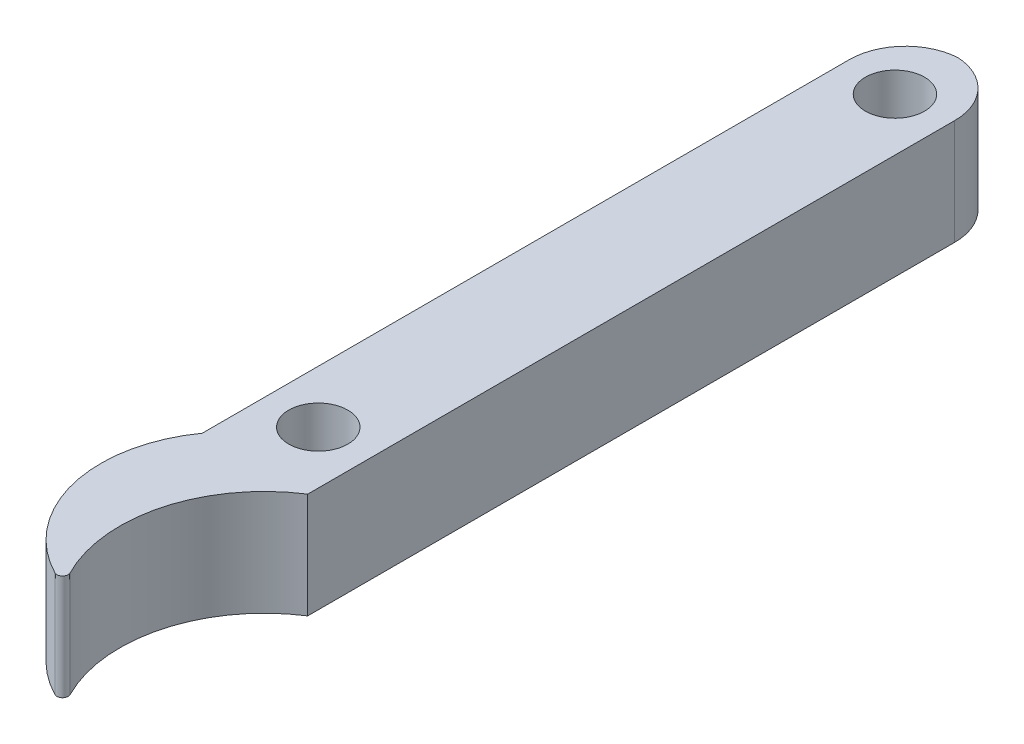
ISO-10303-21;
HEADER;
FILE_DESCRIPTION(('STEP AP214'),'2;1');
FILE_NAME('part.step','',(''),(''),'','','');
FILE_SCHEMA(('AUTOMOTIVE_DESIGN { 1 0 10303 214 1 1 1 1 }'));
ENDSEC;
DATA;
#1=APPLICATION_CONTEXT('core data for automotive mechanical design processes');
#2=APPLICATION_PROTOCOL_DEFINITION('international standard','automotive_design',2000,#1);
#3=PRODUCT_CONTEXT('',#1,'mechanical');
#4=PRODUCT('Part','Part','',(#3));
#5=PRODUCT_RELATED_PRODUCT_CATEGORY('part','',(#4));
#6=PRODUCT_DEFINITION_FORMATION('','',#4);
#7=PRODUCT_DEFINITION_CONTEXT('part definition',#1,'design');
#8=PRODUCT_DEFINITION('design','',#6,#7);
#9=PRODUCT_DEFINITION_SHAPE('','',#8);
#10=(LENGTH_UNIT() NAMED_UNIT(*) SI_UNIT(.MILLI.,.METRE.));
#11=(NAMED_UNIT(*) PLANE_ANGLE_UNIT() SI_UNIT($,.RADIAN.));
#12=(NAMED_UNIT(*) SI_UNIT($,.STERADIAN.) SOLID_ANGLE_UNIT());
#13=UNCERTAINTY_MEASURE_WITH_UNIT(LENGTH_MEASURE(1.E-05),#10,'distance_accuracy_value','');
#14=(GEOMETRIC_REPRESENTATION_CONTEXT(3) GLOBAL_UNCERTAINTY_ASSIGNED_CONTEXT((#13)) GLOBAL_UNIT_ASSIGNED_CONTEXT((#10,
#11,#12)) REPRESENTATION_CONTEXT('',''));
#15=CARTESIAN_POINT('',(0.,0.,0.));
#16=DIRECTION('',(0.,0.,1.));
#17=DIRECTION('',(1.,0.,0.));
#18=AXIS2_PLACEMENT_3D('',#15,#16,#17);
#19=CARTESIAN_POINT('',(11.8186085481253,9.525,42.7233571040695));
#20=DIRECTION('',(0.,-1.,0.));
#21=DIRECTION('',(0.,0.,-1.));
#22=AXIS2_PLACEMENT_3D('',#19,#20,#21);
#23=PLANE('',#22);
#24=CARTESIAN_POINT('',(4.96913287929491,9.525,38.6874450668192));
#25=DIRECTION('',(0.,1.,0.));
#26=DIRECTION('',(0.,0.,1.));
#27=AXIS2_PLACEMENT_3D('',#24,#25,#26);
#28=CIRCLE('',#27,11.9512686587035);
#29=CARTESIAN_POINT('',(-4.7625,9.525,31.75));
#30=VERTEX_POINT('',#29);
#31=CARTESIAN_POINT('',(-0.497427924267538,9.525,49.3152169656446));
#32=VERTEX_POINT('',#31);
#33=EDGE_CURVE('E136',#30,#32,#28,.T.);
#34=ORIENTED_EDGE('',*,*,#33,.T.);
#35=CARTESIAN_POINT('',(-0.265066576906531,9.525,48.8634734496396));
#36=DIRECTION('',(0.,-1.,0.));
#37=DIRECTION('',(0.,0.,-1.));
#38=AXIS2_PLACEMENT_3D('',#35,#36,#37);
#39=CIRCLE('',#38,0.508);
#40=CARTESIAN_POINT('',(0.187819517976608,9.525,48.6333469951379));
#41=VERTEX_POINT('',#40);
#42=EDGE_CURVE('E11',#32,#41,#39,.F.);
#43=ORIENTED_EDGE('',*,*,#42,.T.);
#44=CARTESIAN_POINT('',(11.8186085481253,9.525,42.7233571040695));
#45=DIRECTION('',(0.,-1.,0.));
#46=DIRECTION('',(0.,0.,-1.));
#47=AXIS2_PLACEMENT_3D('',#44,#45,#46);
#48=CIRCLE('',#47,13.0461961496966);
#49=CARTESIAN_POINT('',(4.7625,9.525,31.75));
#50=VERTEX_POINT('',#49);
#51=EDGE_CURVE('E106',#41,#50,#48,.T.);
#52=ORIENTED_EDGE('',*,*,#51,.T.);
#53=DIRECTION('',(0.,0.,-1.));
#54=VECTOR('',#53,1.);
#55=CARTESIAN_POINT('',(4.7625,9.525,-31.75));
#56=LINE('',#55,#54);
#57=CARTESIAN_POINT('',(4.7625,9.525,-26.67));
#58=VERTEX_POINT('',#57);
#59=EDGE_CURVE('E109',#50,#58,#56,.T.);
#60=ORIENTED_EDGE('',*,*,#59,.T.);
#61=CARTESIAN_POINT('',(-0.317500000000002,9.525,-26.67));
#62=DIRECTION('',(0.,-1.,0.));
#63=DIRECTION('',(0.,0.,-1.));
#64=AXIS2_PLACEMENT_3D('',#61,#62,#63);
#65=CIRCLE('',#64,5.08);
#66=CARTESIAN_POINT('',(0.,9.525,-31.7400684166981));
#67=VERTEX_POINT('',#66);
#68=EDGE_CURVE('E144',#58,#67,#65,.F.);
#69=ORIENTED_EDGE('',*,*,#68,.T.);
#70=CARTESIAN_POINT('',(0.317499999999996,9.525,-26.67));
#71=DIRECTION('',(0.,-1.,0.));
#72=DIRECTION('',(0.,0.,-1.));
#73=AXIS2_PLACEMENT_3D('',#70,#71,#72);
#74=CIRCLE('',#73,5.08);
#75=CARTESIAN_POINT('',(-4.7625,9.525,-26.67));
#76=VERTEX_POINT('',#75);
#77=EDGE_CURVE('E142',#67,#76,#74,.F.);
#78=ORIENTED_EDGE('',*,*,#77,.T.);
#79=DIRECTION('',(0.,0.,1.));
#80=VECTOR('',#79,1.);
#81=CARTESIAN_POINT('',(-4.7625,9.525,-31.75));
#82=LINE('',#81,#80);
#83=EDGE_CURVE('E125',#76,#30,#82,.T.);
#84=ORIENTED_EDGE('',*,*,#83,.T.);
#85=EDGE_LOOP('',(#34,#43,#52,#60,#69,#78,#84));
#86=FACE_BOUND('',#85,.T.);
#87=CARTESIAN_POINT('',(0.,9.525,26.035));
#88=DIRECTION('',(0.,1.,0.));
#89=DIRECTION('',(0.,0.,1.));
#90=AXIS2_PLACEMENT_3D('',#87,#88,#89);
#91=CIRCLE('',#90,2.667);
#92=CARTESIAN_POINT('',(0.,9.525,23.368));
#93=VERTEX_POINT('',#92);
#94=EDGE_CURVE('E158',#93,#93,#91,.T.);
#95=ORIENTED_EDGE('',*,*,#94,.F.);
#96=EDGE_LOOP('',(#95));
#97=FACE_BOUND('',#96,.T.);
#98=CARTESIAN_POINT('',(0.,9.525,-26.035));
#99=DIRECTION('',(0.,1.,0.));
#100=DIRECTION('',(0.,0.,1.));
#101=AXIS2_PLACEMENT_3D('',#98,#99,#100);
#102=CIRCLE('',#101,2.667);
#103=CARTESIAN_POINT('',(0.,9.525,-28.702));
#104=VERTEX_POINT('',#103);
#105=EDGE_CURVE('E214',#104,#104,#102,.T.);
#106=ORIENTED_EDGE('',*,*,#105,.F.);
#107=EDGE_LOOP('',(#106));
#108=FACE_BOUND('',#107,.T.);
#109=ADVANCED_FACE('F47',(#86,#97,#108),#23,.F.);
#110=CARTESIAN_POINT('',(11.8186085481253,0.,42.7233571040695));
#111=DIRECTION('',(0.,-1.,0.));
#112=DIRECTION('',(0.,0.,-1.));
#113=AXIS2_PLACEMENT_3D('',#110,#111,#112);
#114=PLANE('',#113);
#115=CARTESIAN_POINT('',(0.,0.,26.035));
#116=DIRECTION('',(0.,1.,0.));
#117=DIRECTION('',(0.,0.,1.));
#118=AXIS2_PLACEMENT_3D('',#115,#116,#117);
#119=CIRCLE('',#118,2.667);
#120=CARTESIAN_POINT('',(0.,0.,23.368));
#121=VERTEX_POINT('',#120);
#122=EDGE_CURVE('E163',#121,#121,#119,.T.);
#123=ORIENTED_EDGE('',*,*,#122,.T.);
#124=EDGE_LOOP('',(#123));
#125=FACE_BOUND('',#124,.T.);
#126=CARTESIAN_POINT('',(11.8186085481253,0.,42.7233571040695));
#127=DIRECTION('',(0.,-1.,0.));
#128=DIRECTION('',(0.,0.,-1.));
#129=AXIS2_PLACEMENT_3D('',#126,#127,#128);
#130=CIRCLE('',#129,13.0461961496966);
#131=CARTESIAN_POINT('',(0.187819517976608,0.,48.6333469951379));
#132=VERTEX_POINT('',#131);
#133=CARTESIAN_POINT('',(4.7625,0.,31.75));
#134=VERTEX_POINT('',#133);
#135=EDGE_CURVE('E128',#132,#134,#130,.T.);
#136=ORIENTED_EDGE('',*,*,#135,.F.);
#137=CARTESIAN_POINT('',(-0.265066576906531,0.,48.8634734496396));
#138=DIRECTION('',(0.,-1.,0.));
#139=DIRECTION('',(0.,0.,-1.));
#140=AXIS2_PLACEMENT_3D('',#137,#138,#139);
#141=CIRCLE('',#140,0.508);
#142=CARTESIAN_POINT('',(-0.497427924267538,0.,49.3152169656446));
#143=VERTEX_POINT('',#142);
#144=EDGE_CURVE('E69',#132,#143,#141,.T.);
#145=ORIENTED_EDGE('',*,*,#144,.T.);
#146=CARTESIAN_POINT('',(4.96913287929491,0.,38.6874450668192));
#147=DIRECTION('',(0.,1.,0.));
#148=DIRECTION('',(0.,0.,1.));
#149=AXIS2_PLACEMENT_3D('',#146,#147,#148);
#150=CIRCLE('',#149,11.9512686587035);
#151=CARTESIAN_POINT('',(-4.7625,0.,31.75));
#152=VERTEX_POINT('',#151);
#153=EDGE_CURVE('E115',#152,#143,#150,.T.);
#154=ORIENTED_EDGE('',*,*,#153,.F.);
#155=DIRECTION('',(0.,0.,1.));
#156=VECTOR('',#155,1.);
#157=CARTESIAN_POINT('',(-4.7625,0.,-31.75));
#158=LINE('',#157,#156);
#159=CARTESIAN_POINT('',(-4.7625,0.,-26.67));
#160=VERTEX_POINT('',#159);
#161=EDGE_CURVE('E160',#160,#152,#158,.T.);
#162=ORIENTED_EDGE('',*,*,#161,.F.);
#163=CARTESIAN_POINT('',(0.317499999999996,0.,-26.67));
#164=DIRECTION('',(0.,-1.,0.));
#165=DIRECTION('',(0.,0.,-1.));
#166=AXIS2_PLACEMENT_3D('',#163,#164,#165);
#167=CIRCLE('',#166,5.08);
#168=CARTESIAN_POINT('',(0.,0.,-31.7400684166981));
#169=VERTEX_POINT('',#168);
#170=EDGE_CURVE('E130',#160,#169,#167,.T.);
#171=ORIENTED_EDGE('',*,*,#170,.T.);
#172=CARTESIAN_POINT('',(-0.317500000000002,0.,-26.67));
#173=DIRECTION('',(0.,-1.,0.));
#174=DIRECTION('',(0.,0.,-1.));
#175=AXIS2_PLACEMENT_3D('',#172,#173,#174);
#176=CIRCLE('',#175,5.08);
#177=CARTESIAN_POINT('',(4.7625,0.,-26.67));
#178=VERTEX_POINT('',#177);
#179=EDGE_CURVE('E133',#169,#178,#176,.T.);
#180=ORIENTED_EDGE('',*,*,#179,.T.);
#181=DIRECTION('',(0.,0.,-1.));
#182=VECTOR('',#181,1.);
#183=CARTESIAN_POINT('',(4.7625,0.,-31.75));
#184=LINE('',#183,#182);
#185=EDGE_CURVE('E157',#134,#178,#184,.T.);
#186=ORIENTED_EDGE('',*,*,#185,.F.);
#187=EDGE_LOOP('',(#136,#145,#154,#162,#171,#180,#186));
#188=FACE_BOUND('',#187,.T.);
#189=CARTESIAN_POINT('',(0.,0.,-26.035));
#190=DIRECTION('',(0.,1.,0.));
#191=DIRECTION('',(0.,0.,1.));
#192=AXIS2_PLACEMENT_3D('',#189,#190,#191);
#193=CIRCLE('',#192,2.667);
#194=CARTESIAN_POINT('',(0.,0.,-28.702));
#195=VERTEX_POINT('',#194);
#196=EDGE_CURVE('E152',#195,#195,#193,.T.);
#197=ORIENTED_EDGE('',*,*,#196,.T.);
#198=EDGE_LOOP('',(#197));
#199=FACE_BOUND('',#198,.T.);
#200=ADVANCED_FACE('F155',(#125,#188,#199),#114,.T.);
#201=CARTESIAN_POINT('',(11.8186085481253,9.525,42.7233571040695));
#202=DIRECTION('',(0.,-1.,0.));
#203=DIRECTION('',(0.,0.,-1.));
#204=AXIS2_PLACEMENT_3D('',#201,#202,#203);
#205=CYLINDRICAL_SURFACE('',#204,13.0461961496966);
#206=ORIENTED_EDGE('',*,*,#51,.F.);
#207=DIRECTION('',(0.,-1.,0.));
#208=VECTOR('',#207,1.);
#209=CARTESIAN_POINT('',(0.187819517976608,9.525,48.6333469951379));
#210=LINE('',#209,#208);
#211=EDGE_CURVE('E148',#41,#132,#210,.T.);
#212=ORIENTED_EDGE('',*,*,#211,.T.);
#213=ORIENTED_EDGE('',*,*,#135,.T.);
#214=DIRECTION('',(0.,-1.,0.));
#215=VECTOR('',#214,1.);
#216=CARTESIAN_POINT('',(4.7625,9.525,31.75));
#217=LINE('',#216,#215);
#218=EDGE_CURVE('E122',#50,#134,#217,.T.);
#219=ORIENTED_EDGE('',*,*,#218,.F.);
#220=EDGE_LOOP('',(#206,#212,#213,#219));
#221=FACE_BOUND('',#220,.T.);
#222=ADVANCED_FACE('F127',(#221),#205,.F.);
#223=CARTESIAN_POINT('',(4.7625,9.525,-31.75));
#224=DIRECTION('',(-1.,0.,0.));
#225=DIRECTION('',(0.,0.,1.));
#226=AXIS2_PLACEMENT_3D('',#223,#224,#225);
#227=PLANE('',#226);
#228=ORIENTED_EDGE('',*,*,#185,.T.);
#229=DIRECTION('',(0.,-1.,0.));
#230=VECTOR('',#229,1.);
#231=CARTESIAN_POINT('',(4.7625,9.525,-26.67));
#232=LINE('',#231,#230);
#233=EDGE_CURVE('E124',#178,#58,#232,.F.);
#234=ORIENTED_EDGE('',*,*,#233,.T.);
#235=ORIENTED_EDGE('',*,*,#59,.F.);
#236=ORIENTED_EDGE('',*,*,#218,.T.);
#237=EDGE_LOOP('',(#228,#234,#235,#236));
#238=FACE_BOUND('',#237,.T.);
#239=ADVANCED_FACE('F121',(#238),#227,.F.);
#240=CARTESIAN_POINT('',(-4.7625,9.525,-31.75));
#241=DIRECTION('',(1.,0.,0.));
#242=DIRECTION('',(0.,0.,-1.));
#243=AXIS2_PLACEMENT_3D('',#240,#241,#242);
#244=PLANE('',#243);
#245=ORIENTED_EDGE('',*,*,#83,.F.);
#246=DIRECTION('',(0.,-1.,0.));
#247=VECTOR('',#246,1.);
#248=CARTESIAN_POINT('',(-4.7625,9.525,-26.67));
#249=LINE('',#248,#247);
#250=EDGE_CURVE('E146',#76,#160,#249,.T.);
#251=ORIENTED_EDGE('',*,*,#250,.T.);
#252=ORIENTED_EDGE('',*,*,#161,.T.);
#253=DIRECTION('',(0.,-1.,0.));
#254=VECTOR('',#253,1.);
#255=CARTESIAN_POINT('',(-4.7625,9.525,31.75));
#256=LINE('',#255,#254);
#257=EDGE_CURVE('E131',#30,#152,#256,.T.);
#258=ORIENTED_EDGE('',*,*,#257,.F.);
#259=EDGE_LOOP('',(#245,#251,#252,#258));
#260=FACE_BOUND('',#259,.T.);
#261=ADVANCED_FACE('F192',(#260),#244,.F.);
#262=CARTESIAN_POINT('',(4.96913287929491,9.525,38.6874450668192));
#263=DIRECTION('',(0.,-1.,0.));
#264=DIRECTION('',(0.,0.,-1.));
#265=AXIS2_PLACEMENT_3D('',#262,#263,#264);
#266=CYLINDRICAL_SURFACE('',#265,11.9512686587035);
#267=ORIENTED_EDGE('',*,*,#153,.T.);
#268=DIRECTION('',(0.,-1.,0.));
#269=VECTOR('',#268,1.);
#270=CARTESIAN_POINT('',(-0.497427924267538,9.525,49.3152169656446));
#271=LINE('',#270,#269);
#272=EDGE_CURVE('E55',#143,#32,#271,.F.);
#273=ORIENTED_EDGE('',*,*,#272,.T.);
#274=ORIENTED_EDGE('',*,*,#33,.F.);
#275=ORIENTED_EDGE('',*,*,#257,.T.);
#276=EDGE_LOOP('',(#267,#273,#274,#275));
#277=FACE_BOUND('',#276,.T.);
#278=ADVANCED_FACE('F168',(#277),#266,.T.);
#279=CARTESIAN_POINT('',(0.,9.525,26.035));
#280=DIRECTION('',(0.,-1.,0.));
#281=DIRECTION('',(0.,0.,-1.));
#282=AXIS2_PLACEMENT_3D('',#279,#280,#281);
#283=CYLINDRICAL_SURFACE('',#282,2.667);
#284=CARTESIAN_POINT('',(0.,9.525,23.368));
#285=CARTESIAN_POINT('',(0.,9.42578125,23.368));
#286=CARTESIAN_POINT('',(0.,9.3265625,23.368));
#287=CARTESIAN_POINT('',(0.,9.128125,23.368));
#288=CARTESIAN_POINT('',(0.,9.02890625,23.368));
#289=CARTESIAN_POINT('',(0.,8.83046875,23.368));
#290=CARTESIAN_POINT('',(0.,8.73125,23.368));
#291=CARTESIAN_POINT('',(0.,8.5328125,23.368));
#292=CARTESIAN_POINT('',(0.,8.43359375,23.368));
#293=CARTESIAN_POINT('',(0.,8.23515625,23.368));
#294=CARTESIAN_POINT('',(0.,8.1359375,23.368));
#295=CARTESIAN_POINT('',(0.,7.9375,23.368));
#296=CARTESIAN_POINT('',(0.,7.83828125,23.368));
#297=CARTESIAN_POINT('',(0.,7.63984375,23.368));
#298=CARTESIAN_POINT('',(0.,7.540625,23.368));
#299=CARTESIAN_POINT('',(0.,7.3421875,23.368));
#300=CARTESIAN_POINT('',(0.,7.24296875,23.368));
#301=CARTESIAN_POINT('',(0.,7.04453125,23.368));
#302=CARTESIAN_POINT('',(0.,6.9453125,23.368));
#303=CARTESIAN_POINT('',(0.,6.746875,23.368));
#304=CARTESIAN_POINT('',(0.,6.64765625,23.368));
#305=CARTESIAN_POINT('',(0.,6.44921875,23.368));
#306=CARTESIAN_POINT('',(0.,6.35,23.368));
#307=CARTESIAN_POINT('',(0.,6.1515625,23.368));
#308=CARTESIAN_POINT('',(0.,6.05234375,23.368));
#309=CARTESIAN_POINT('',(0.,5.85390625,23.368));
#310=CARTESIAN_POINT('',(0.,5.7546875,23.368));
#311=CARTESIAN_POINT('',(0.,5.55625,23.368));
#312=CARTESIAN_POINT('',(0.,5.45703125,23.368));
#313=CARTESIAN_POINT('',(0.,5.25859375,23.368));
#314=CARTESIAN_POINT('',(0.,5.159375,23.368));
#315=CARTESIAN_POINT('',(0.,4.9609375,23.368));
#316=CARTESIAN_POINT('',(0.,4.86171875,23.368));
#317=CARTESIAN_POINT('',(0.,4.66328125,23.368));
#318=CARTESIAN_POINT('',(0.,4.5640625,23.368));
#319=CARTESIAN_POINT('',(0.,4.365625,23.368));
#320=CARTESIAN_POINT('',(0.,4.26640625,23.368));
#321=CARTESIAN_POINT('',(0.,4.06796875,23.368));
#322=CARTESIAN_POINT('',(0.,3.96875,23.368));
#323=CARTESIAN_POINT('',(0.,3.7703125,23.368));
#324=CARTESIAN_POINT('',(0.,3.67109375,23.368));
#325=CARTESIAN_POINT('',(0.,3.47265625,23.368));
#326=CARTESIAN_POINT('',(0.,3.3734375,23.368));
#327=CARTESIAN_POINT('',(0.,3.175,23.368));
#328=CARTESIAN_POINT('',(0.,3.07578125,23.368));
#329=CARTESIAN_POINT('',(0.,2.87734375,23.368));
#330=CARTESIAN_POINT('',(0.,2.778125,23.368));
#331=CARTESIAN_POINT('',(0.,2.5796875,23.368));
#332=CARTESIAN_POINT('',(0.,2.48046875,23.368));
#333=CARTESIAN_POINT('',(0.,2.28203125,23.368));
#334=CARTESIAN_POINT('',(0.,2.1828125,23.368));
#335=CARTESIAN_POINT('',(0.,1.984375,23.368));
#336=CARTESIAN_POINT('',(0.,1.88515625,23.368));
#337=CARTESIAN_POINT('',(0.,1.68671875,23.368));
#338=CARTESIAN_POINT('',(0.,1.5875,23.368));
#339=CARTESIAN_POINT('',(0.,1.3890625,23.368));
#340=CARTESIAN_POINT('',(0.,1.28984375,23.368));
#341=CARTESIAN_POINT('',(0.,1.09140625,23.368));
#342=CARTESIAN_POINT('',(0.,0.992187500000001,23.368));
#343=CARTESIAN_POINT('',(0.,0.793750000000001,23.368));
#344=CARTESIAN_POINT('',(0.,0.69453125,23.368));
#345=CARTESIAN_POINT('',(0.,0.49609375,23.368));
#346=CARTESIAN_POINT('',(0.,0.396875,23.368));
#347=CARTESIAN_POINT('',(0.,0.1984375,23.368));
#348=CARTESIAN_POINT('',(0.,0.0992187500000001,23.368));
#349=CARTESIAN_POINT('',(0.,0.,23.368));
#350=B_SPLINE_CURVE_WITH_KNOTS('',3,(#284,#285,#286,#287,#288,#289,#290,#291,#292,#293,#294,
#295,#296,#297,#298,#299,#300,#301,#302,#303,#304,#305,#306,#307,#308,#309,#310,#311,#312,#313,
#314,#315,#316,#317,#318,#319,#320,#321,#322,#323,#324,#325,#326,#327,#328,#329,#330,#331,#332,
#333,#334,#335,#336,#337,#338,#339,#340,#341,#342,#343,#344,#345,#346,#347,#348,#349),
.UNSPECIFIED.,.F.,.F.,(4,2,2,2,2,2,2,2,2,2,2,2,2,2,2,2,2,2,2,2,2,2,2,2,2,2,2,2,2,2,2,2,4),(0.,
0.29765625,0.5953125,0.892968750000001,1.190625,1.48828125,1.7859375,2.08359375,2.38125,
2.67890625,2.9765625,3.27421875,3.571875,3.86953125,4.1671875,4.46484375,4.7625,5.06015625,
5.3578125,5.65546875,5.953125,6.25078125,6.5484375,6.84609375,7.14375,7.44140625,7.7390625,
8.03671875,8.334375,8.63203125,8.9296875,9.22734375,9.525),.UNSPECIFIED.);
#351=EDGE_CURVE('BSEAM187',#93,#121,#350,.T.);
#352=ORIENTED_EDGE('',*,*,#94,.T.);
#353=ORIENTED_EDGE('',*,*,#122,.F.);
#354=ORIENTED_EDGE('',*,*,#351,.T.);
#355=ORIENTED_EDGE('',*,*,#351,.F.);
#356=EDGE_LOOP('',(#352,#354,#353,#355));
#357=FACE_BOUND('',#356,.T.);
#358=ADVANCED_FACE('F187',(#357),#283,.F.);
#359=CARTESIAN_POINT('',(0.,9.525,-26.035));
#360=DIRECTION('',(0.,-1.,0.));
#361=DIRECTION('',(0.,0.,-1.));
#362=AXIS2_PLACEMENT_3D('',#359,#360,#361);
#363=CYLINDRICAL_SURFACE('',#362,2.667);
#364=CARTESIAN_POINT('',(0.,9.525,-28.702));
#365=CARTESIAN_POINT('',(0.,9.42578125,-28.702));
#366=CARTESIAN_POINT('',(0.,9.3265625,-28.702));
#367=CARTESIAN_POINT('',(0.,9.128125,-28.702));
#368=CARTESIAN_POINT('',(0.,9.02890625,-28.702));
#369=CARTESIAN_POINT('',(0.,8.83046875,-28.702));
#370=CARTESIAN_POINT('',(0.,8.73125,-28.702));
#371=CARTESIAN_POINT('',(0.,8.5328125,-28.702));
#372=CARTESIAN_POINT('',(0.,8.43359375,-28.702));
#373=CARTESIAN_POINT('',(0.,8.23515625,-28.702));
#374=CARTESIAN_POINT('',(0.,8.1359375,-28.702));
#375=CARTESIAN_POINT('',(0.,7.9375,-28.702));
#376=CARTESIAN_POINT('',(0.,7.83828125,-28.702));
#377=CARTESIAN_POINT('',(0.,7.63984375,-28.702));
#378=CARTESIAN_POINT('',(0.,7.540625,-28.702));
#379=CARTESIAN_POINT('',(0.,7.3421875,-28.702));
#380=CARTESIAN_POINT('',(0.,7.24296875,-28.702));
#381=CARTESIAN_POINT('',(0.,7.04453125,-28.702));
#382=CARTESIAN_POINT('',(0.,6.9453125,-28.702));
#383=CARTESIAN_POINT('',(0.,6.746875,-28.702));
#384=CARTESIAN_POINT('',(0.,6.64765625,-28.702));
#385=CARTESIAN_POINT('',(0.,6.44921875,-28.702));
#386=CARTESIAN_POINT('',(0.,6.35,-28.702));
#387=CARTESIAN_POINT('',(0.,6.1515625,-28.702));
#388=CARTESIAN_POINT('',(0.,6.05234375,-28.702));
#389=CARTESIAN_POINT('',(0.,5.85390625,-28.702));
#390=CARTESIAN_POINT('',(0.,5.7546875,-28.702));
#391=CARTESIAN_POINT('',(0.,5.55625,-28.702));
#392=CARTESIAN_POINT('',(0.,5.45703125,-28.702));
#393=CARTESIAN_POINT('',(0.,5.25859375,-28.702));
#394=CARTESIAN_POINT('',(0.,5.159375,-28.702));
#395=CARTESIAN_POINT('',(0.,4.9609375,-28.702));
#396=CARTESIAN_POINT('',(0.,4.86171875,-28.702));
#397=CARTESIAN_POINT('',(0.,4.66328125,-28.702));
#398=CARTESIAN_POINT('',(0.,4.5640625,-28.702));
#399=CARTESIAN_POINT('',(0.,4.365625,-28.702));
#400=CARTESIAN_POINT('',(0.,4.26640625,-28.702));
#401=CARTESIAN_POINT('',(0.,4.06796875,-28.702));
#402=CARTESIAN_POINT('',(0.,3.96875,-28.702));
#403=CARTESIAN_POINT('',(0.,3.7703125,-28.702));
#404=CARTESIAN_POINT('',(0.,3.67109375,-28.702));
#405=CARTESIAN_POINT('',(0.,3.47265625,-28.702));
#406=CARTESIAN_POINT('',(0.,3.3734375,-28.702));
#407=CARTESIAN_POINT('',(0.,3.175,-28.702));
#408=CARTESIAN_POINT('',(0.,3.07578125,-28.702));
#409=CARTESIAN_POINT('',(0.,2.87734375,-28.702));
#410=CARTESIAN_POINT('',(0.,2.778125,-28.702));
#411=CARTESIAN_POINT('',(0.,2.5796875,-28.702));
#412=CARTESIAN_POINT('',(0.,2.48046875,-28.702));
#413=CARTESIAN_POINT('',(0.,2.28203125,-28.702));
#414=CARTESIAN_POINT('',(0.,2.1828125,-28.702));
#415=CARTESIAN_POINT('',(0.,1.984375,-28.702));
#416=CARTESIAN_POINT('',(0.,1.88515625,-28.702));
#417=CARTESIAN_POINT('',(0.,1.68671875,-28.702));
#418=CARTESIAN_POINT('',(0.,1.5875,-28.702));
#419=CARTESIAN_POINT('',(0.,1.3890625,-28.702));
#420=CARTESIAN_POINT('',(0.,1.28984375,-28.702));
#421=CARTESIAN_POINT('',(0.,1.09140625,-28.702));
#422=CARTESIAN_POINT('',(0.,0.992187500000001,-28.702));
#423=CARTESIAN_POINT('',(0.,0.793750000000001,-28.702));
#424=CARTESIAN_POINT('',(0.,0.69453125,-28.702));
#425=CARTESIAN_POINT('',(0.,0.49609375,-28.702));
#426=CARTESIAN_POINT('',(0.,0.396875,-28.702));
#427=CARTESIAN_POINT('',(0.,0.1984375,-28.702));
#428=CARTESIAN_POINT('',(0.,0.0992187500000001,-28.702));
#429=CARTESIAN_POINT('',(0.,0.,-28.702));
#430=B_SPLINE_CURVE_WITH_KNOTS('',3,(#364,#365,#366,#367,#368,#369,#370,#371,#372,#373,#374,
#375,#376,#377,#378,#379,#380,#381,#382,#383,#384,#385,#386,#387,#388,#389,#390,#391,#392,#393,
#394,#395,#396,#397,#398,#399,#400,#401,#402,#403,#404,#405,#406,#407,#408,#409,#410,#411,#412,
#413,#414,#415,#416,#417,#418,#419,#420,#421,#422,#423,#424,#425,#426,#427,#428,#429),
.UNSPECIFIED.,.F.,.F.,(4,2,2,2,2,2,2,2,2,2,2,2,2,2,2,2,2,2,2,2,2,2,2,2,2,2,2,2,2,2,2,2,4),(0.,
0.29765625,0.5953125,0.892968750000001,1.190625,1.48828125,1.7859375,2.08359375,2.38125,
2.67890625,2.9765625,3.27421875,3.571875,3.86953125,4.1671875,4.46484375,4.7625,5.06015625,
5.3578125,5.65546875,5.953125,6.25078125,6.5484375,6.84609375,7.14375,7.44140625,7.7390625,
8.03671875,8.334375,8.63203125,8.9296875,9.22734375,9.525),.UNSPECIFIED.);
#431=EDGE_CURVE('BSEAM200',#104,#195,#430,.T.);
#432=ORIENTED_EDGE('',*,*,#105,.T.);
#433=ORIENTED_EDGE('',*,*,#196,.F.);
#434=ORIENTED_EDGE('',*,*,#431,.T.);
#435=ORIENTED_EDGE('',*,*,#431,.F.);
#436=EDGE_LOOP('',(#432,#434,#433,#435));
#437=FACE_BOUND('',#436,.T.);
#438=ADVANCED_FACE('F200',(#437),#363,.F.);
#439=CARTESIAN_POINT('',(0.317499999999996,9.525,-26.67));
#440=DIRECTION('',(0.,-1.,0.));
#441=DIRECTION('',(0.,0.,-1.));
#442=AXIS2_PLACEMENT_3D('',#439,#440,#441);
#443=CYLINDRICAL_SURFACE('',#442,5.08);
#444=ORIENTED_EDGE('',*,*,#250,.F.);
#445=ORIENTED_EDGE('',*,*,#77,.F.);
#446=DIRECTION('',(0.,-1.,0.));
#447=VECTOR('',#446,1.);
#448=CARTESIAN_POINT('',(0.,4.7625,-31.7400684166981));
#449=LINE('',#448,#447);
#450=EDGE_CURVE('E149',#169,#67,#449,.F.);
#451=ORIENTED_EDGE('',*,*,#450,.F.);
#452=ORIENTED_EDGE('',*,*,#170,.F.);
#453=EDGE_LOOP('',(#444,#445,#451,#452));
#454=FACE_BOUND('',#453,.T.);
#455=ADVANCED_FACE('F176',(#454),#443,.T.);
#456=CARTESIAN_POINT('',(-0.317500000000002,9.525,-26.67));
#457=DIRECTION('',(0.,-1.,0.));
#458=DIRECTION('',(0.,0.,-1.));
#459=AXIS2_PLACEMENT_3D('',#456,#457,#458);
#460=CYLINDRICAL_SURFACE('',#459,5.08);
#461=ORIENTED_EDGE('',*,*,#68,.F.);
#462=ORIENTED_EDGE('',*,*,#233,.F.);
#463=ORIENTED_EDGE('',*,*,#179,.F.);
#464=ORIENTED_EDGE('',*,*,#450,.T.);
#465=EDGE_LOOP('',(#461,#462,#463,#464));
#466=FACE_BOUND('',#465,.T.);
#467=ADVANCED_FACE('F172',(#466),#460,.T.);
#468=CARTESIAN_POINT('',(-0.265066576906531,9.525,48.8634734496396));
#469=DIRECTION('',(0.,1.,0.));
#470=DIRECTION('',(0.,0.,1.));
#471=AXIS2_PLACEMENT_3D('',#468,#469,#470);
#472=CYLINDRICAL_SURFACE('',#471,0.508);
#473=ORIENTED_EDGE('',*,*,#42,.F.);
#474=ORIENTED_EDGE('',*,*,#272,.F.);
#475=ORIENTED_EDGE('',*,*,#144,.F.);
#476=ORIENTED_EDGE('',*,*,#211,.F.);
#477=EDGE_LOOP('',(#473,#474,#475,#476));
#478=FACE_BOUND('',#477,.T.);
#479=ADVANCED_FACE('F49',(#478),#472,.T.);
#480=CLOSED_SHELL('',(#109,#200,#222,#239,#261,#278,#358,#438,#455,#467,#479));
#481=MANIFOLD_SOLID_BREP('B2',#480);
#482=ADVANCED_BREP_SHAPE_REPRESENTATION('',(#18,#481),#14);
#483=SHAPE_DEFINITION_REPRESENTATION(#9,#482);
ENDSEC;
END-ISO-10303-21;
